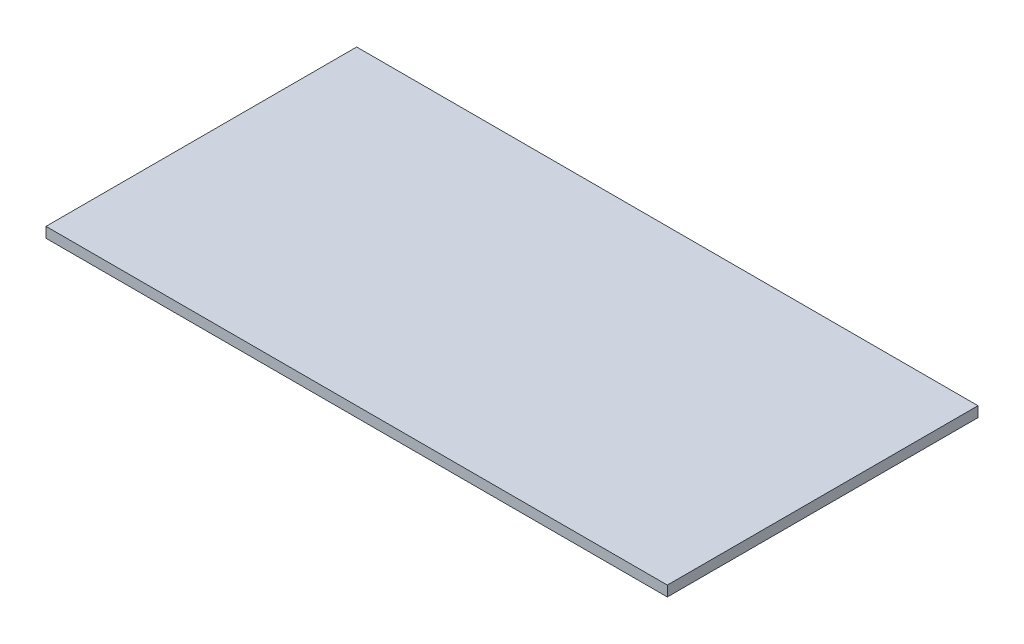
ISO-10303-21;
HEADER;
FILE_DESCRIPTION(('STEP AP214'),'2;1');
FILE_NAME('part.step','',(''),(''),'','','');
FILE_SCHEMA(('AUTOMOTIVE_DESIGN { 1 0 10303 214 1 1 1 1 }'));
ENDSEC;
DATA;
#1=APPLICATION_CONTEXT('core data for automotive mechanical design processes');
#2=APPLICATION_PROTOCOL_DEFINITION('international standard','automotive_design',2000,#1);
#3=PRODUCT_CONTEXT('',#1,'mechanical');
#4=PRODUCT('Part','Part','',(#3));
#5=PRODUCT_RELATED_PRODUCT_CATEGORY('part','',(#4));
#6=PRODUCT_DEFINITION_FORMATION('','',#4);
#7=PRODUCT_DEFINITION_CONTEXT('part definition',#1,'design');
#8=PRODUCT_DEFINITION('design','',#6,#7);
#9=PRODUCT_DEFINITION_SHAPE('','',#8);
#10=(LENGTH_UNIT() NAMED_UNIT(*) SI_UNIT(.MILLI.,.METRE.));
#11=(NAMED_UNIT(*) PLANE_ANGLE_UNIT() SI_UNIT($,.RADIAN.));
#12=(NAMED_UNIT(*) SI_UNIT($,.STERADIAN.) SOLID_ANGLE_UNIT());
#13=UNCERTAINTY_MEASURE_WITH_UNIT(LENGTH_MEASURE(1.E-05),#10,'distance_accuracy_value','');
#14=(GEOMETRIC_REPRESENTATION_CONTEXT(3) GLOBAL_UNCERTAINTY_ASSIGNED_CONTEXT((#13)) GLOBAL_UNIT_ASSIGNED_CONTEXT((#10,
#11,#12)) REPRESENTATION_CONTEXT('',''));
#15=CARTESIAN_POINT('',(0.,0.,0.));
#16=DIRECTION('',(0.,0.,1.));
#17=DIRECTION('',(1.,0.,0.));
#18=AXIS2_PLACEMENT_3D('',#15,#16,#17);
#19=CARTESIAN_POINT('',(0.,10.,0.));
#20=DIRECTION('',(1.,0.,0.));
#21=DIRECTION('',(0.,0.,-1.));
#22=AXIS2_PLACEMENT_3D('',#19,#20,#21);
#23=PLANE('',#22);
#24=DIRECTION('',(0.,0.,1.));
#25=VECTOR('',#24,1.);
#26=CARTESIAN_POINT('',(0.,0.,0.));
#27=LINE('',#26,#25);
#28=CARTESIAN_POINT('',(0.,0.,-300.));
#29=VERTEX_POINT('',#28);
#30=CARTESIAN_POINT('',(0.,0.,0.));
#31=VERTEX_POINT('',#30);
#32=EDGE_CURVE('E97',#29,#31,#27,.T.);
#33=ORIENTED_EDGE('',*,*,#32,.T.);
#34=DIRECTION('',(0.,-1.,0.));
#35=VECTOR('',#34,1.);
#36=CARTESIAN_POINT('',(0.,10.,0.));
#37=LINE('',#36,#35);
#38=CARTESIAN_POINT('',(0.,10.,0.));
#39=VERTEX_POINT('',#38);
#40=EDGE_CURVE('E11',#39,#31,#37,.T.);
#41=ORIENTED_EDGE('',*,*,#40,.F.);
#42=DIRECTION('',(0.,0.,1.));
#43=VECTOR('',#42,1.);
#44=CARTESIAN_POINT('',(0.,10.,0.));
#45=LINE('',#44,#43);
#46=CARTESIAN_POINT('',(0.,10.,-300.));
#47=VERTEX_POINT('',#46);
#48=EDGE_CURVE('E85',#47,#39,#45,.T.);
#49=ORIENTED_EDGE('',*,*,#48,.F.);
#50=DIRECTION('',(0.,-1.,0.));
#51=VECTOR('',#50,1.);
#52=CARTESIAN_POINT('',(0.,10.,-300.));
#53=LINE('',#52,#51);
#54=EDGE_CURVE('E93',#47,#29,#53,.T.);
#55=ORIENTED_EDGE('',*,*,#54,.T.);
#56=EDGE_LOOP('',(#33,#41,#49,#55));
#57=FACE_BOUND('',#56,.T.);
#58=ADVANCED_FACE('F34',(#57),#23,.F.);
#59=CARTESIAN_POINT('',(0.,10.,0.));
#60=DIRECTION('',(0.,0.,-1.));
#61=DIRECTION('',(-1.,0.,0.));
#62=AXIS2_PLACEMENT_3D('',#59,#60,#61);
#63=PLANE('',#62);
#64=DIRECTION('',(1.,0.,0.));
#65=VECTOR('',#64,1.);
#66=CARTESIAN_POINT('',(0.,0.,0.));
#67=LINE('',#66,#65);
#68=CARTESIAN_POINT('',(600.,0.,0.));
#69=VERTEX_POINT('',#68);
#70=EDGE_CURVE('E89',#31,#69,#67,.T.);
#71=ORIENTED_EDGE('',*,*,#70,.T.);
#72=DIRECTION('',(0.,-1.,0.));
#73=VECTOR('',#72,1.);
#74=CARTESIAN_POINT('',(600.,10.,0.));
#75=LINE('',#74,#73);
#76=CARTESIAN_POINT('',(600.,10.,0.));
#77=VERTEX_POINT('',#76);
#78=EDGE_CURVE('E42',#77,#69,#75,.T.);
#79=ORIENTED_EDGE('',*,*,#78,.F.);
#80=DIRECTION('',(1.,0.,0.));
#81=VECTOR('',#80,1.);
#82=CARTESIAN_POINT('',(0.,10.,0.));
#83=LINE('',#82,#81);
#84=EDGE_CURVE('E80',#39,#77,#83,.T.);
#85=ORIENTED_EDGE('',*,*,#84,.F.);
#86=ORIENTED_EDGE('',*,*,#40,.T.);
#87=EDGE_LOOP('',(#71,#79,#85,#86));
#88=FACE_BOUND('',#87,.T.);
#89=ADVANCED_FACE('F88',(#88),#63,.F.);
#90=CARTESIAN_POINT('',(600.,10.,0.));
#91=DIRECTION('',(-1.,0.,0.));
#92=DIRECTION('',(0.,0.,1.));
#93=AXIS2_PLACEMENT_3D('',#90,#91,#92);
#94=PLANE('',#93);
#95=DIRECTION('',(0.,0.,-1.));
#96=VECTOR('',#95,1.);
#97=CARTESIAN_POINT('',(600.,0.,0.));
#98=LINE('',#97,#96);
#99=CARTESIAN_POINT('',(600.,0.,-300.));
#100=VERTEX_POINT('',#99);
#101=EDGE_CURVE('E67',#69,#100,#98,.T.);
#102=ORIENTED_EDGE('',*,*,#101,.T.);
#103=DIRECTION('',(0.,-1.,0.));
#104=VECTOR('',#103,1.);
#105=CARTESIAN_POINT('',(600.,10.,-300.));
#106=LINE('',#105,#104);
#107=CARTESIAN_POINT('',(600.,10.,-300.));
#108=VERTEX_POINT('',#107);
#109=EDGE_CURVE('E90',#108,#100,#106,.T.);
#110=ORIENTED_EDGE('',*,*,#109,.F.);
#111=DIRECTION('',(0.,0.,-1.));
#112=VECTOR('',#111,1.);
#113=CARTESIAN_POINT('',(600.,10.,0.));
#114=LINE('',#113,#112);
#115=EDGE_CURVE('E83',#77,#108,#114,.T.);
#116=ORIENTED_EDGE('',*,*,#115,.F.);
#117=ORIENTED_EDGE('',*,*,#78,.T.);
#118=EDGE_LOOP('',(#102,#110,#116,#117));
#119=FACE_BOUND('',#118,.T.);
#120=ADVANCED_FACE('F91',(#119),#94,.F.);
#121=CARTESIAN_POINT('',(0.,10.,-300.));
#122=DIRECTION('',(0.,0.,1.));
#123=DIRECTION('',(1.,0.,0.));
#124=AXIS2_PLACEMENT_3D('',#121,#122,#123);
#125=PLANE('',#124);
#126=DIRECTION('',(-1.,0.,0.));
#127=VECTOR('',#126,1.);
#128=CARTESIAN_POINT('',(0.,0.,-300.));
#129=LINE('',#128,#127);
#130=EDGE_CURVE('E73',#100,#29,#129,.T.);
#131=ORIENTED_EDGE('',*,*,#130,.T.);
#132=ORIENTED_EDGE('',*,*,#54,.F.);
#133=DIRECTION('',(-1.,0.,0.));
#134=VECTOR('',#133,1.);
#135=CARTESIAN_POINT('',(0.,10.,-300.));
#136=LINE('',#135,#134);
#137=EDGE_CURVE('E50',#108,#47,#136,.T.);
#138=ORIENTED_EDGE('',*,*,#137,.F.);
#139=ORIENTED_EDGE('',*,*,#109,.T.);
#140=EDGE_LOOP('',(#131,#132,#138,#139));
#141=FACE_BOUND('',#140,.T.);
#142=ADVANCED_FACE('F104',(#141),#125,.F.);
#143=CARTESIAN_POINT('',(0.,10.,0.));
#144=DIRECTION('',(0.,-1.,0.));
#145=DIRECTION('',(0.,0.,-1.));
#146=AXIS2_PLACEMENT_3D('',#143,#144,#145);
#147=PLANE('',#146);
#148=ORIENTED_EDGE('',*,*,#48,.T.);
#149=ORIENTED_EDGE('',*,*,#84,.T.);
#150=ORIENTED_EDGE('',*,*,#115,.T.);
#151=ORIENTED_EDGE('',*,*,#137,.T.);
#152=EDGE_LOOP('',(#148,#149,#150,#151));
#153=FACE_BOUND('',#152,.T.);
#154=ADVANCED_FACE('F81',(#153),#147,.F.);
#155=CARTESIAN_POINT('',(0.,0.,0.));
#156=DIRECTION('',(0.,-1.,0.));
#157=DIRECTION('',(0.,0.,-1.));
#158=AXIS2_PLACEMENT_3D('',#155,#156,#157);
#159=PLANE('',#158);
#160=ORIENTED_EDGE('',*,*,#32,.F.);
#161=ORIENTED_EDGE('',*,*,#130,.F.);
#162=ORIENTED_EDGE('',*,*,#101,.F.);
#163=ORIENTED_EDGE('',*,*,#70,.F.);
#164=EDGE_LOOP('',(#160,#161,#162,#163));
#165=FACE_BOUND('',#164,.T.);
#166=ADVANCED_FACE('F107',(#165),#159,.T.);
#167=CLOSED_SHELL('',(#58,#89,#120,#142,#154,#166));
#168=MANIFOLD_SOLID_BREP('B2',#167);
#169=ADVANCED_BREP_SHAPE_REPRESENTATION('',(#18,#168),#14);
#170=SHAPE_DEFINITION_REPRESENTATION(#9,#169);
ENDSEC;
END-ISO-10303-21;
